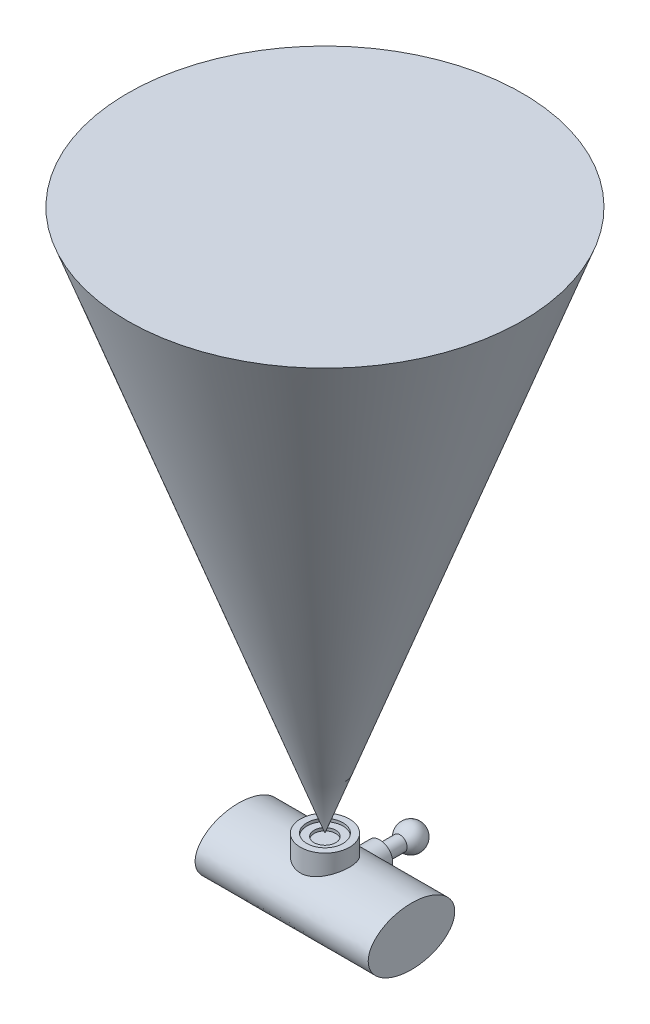
ISO-10303-21;
HEADER;
FILE_DESCRIPTION(('STEP AP214'),'2;1');
FILE_NAME('part.step','',(''),(''),'','','');
FILE_SCHEMA(('AUTOMOTIVE_DESIGN { 1 0 10303 214 1 1 1 1 }'));
ENDSEC;
DATA;
#1=APPLICATION_CONTEXT('core data for automotive mechanical design processes');
#2=APPLICATION_PROTOCOL_DEFINITION('international standard','automotive_design',2000,#1);
#3=PRODUCT_CONTEXT('',#1,'mechanical');
#4=PRODUCT('Part','Part','',(#3));
#5=PRODUCT_RELATED_PRODUCT_CATEGORY('part','',(#4));
#6=PRODUCT_DEFINITION_FORMATION('','',#4);
#7=PRODUCT_DEFINITION_CONTEXT('part definition',#1,'design');
#8=PRODUCT_DEFINITION('design','',#6,#7);
#9=PRODUCT_DEFINITION_SHAPE('','',#8);
#10=(LENGTH_UNIT() NAMED_UNIT(*) SI_UNIT(.MILLI.,.METRE.));
#11=(NAMED_UNIT(*) PLANE_ANGLE_UNIT() SI_UNIT($,.RADIAN.));
#12=(NAMED_UNIT(*) SI_UNIT($,.STERADIAN.) SOLID_ANGLE_UNIT());
#13=UNCERTAINTY_MEASURE_WITH_UNIT(LENGTH_MEASURE(1.E-05),#10,'distance_accuracy_value','');
#14=(GEOMETRIC_REPRESENTATION_CONTEXT(3) GLOBAL_UNCERTAINTY_ASSIGNED_CONTEXT((#13)) GLOBAL_UNIT_ASSIGNED_CONTEXT((#10,
#11,#12)) REPRESENTATION_CONTEXT('',''));
#15=CARTESIAN_POINT('',(0.,0.,0.));
#16=DIRECTION('',(0.,0.,1.));
#17=DIRECTION('',(1.,0.,0.));
#18=AXIS2_PLACEMENT_3D('',#15,#16,#17);
#19=CARTESIAN_POINT('',(0.,203.938524157182,-42.4040286651332));
#20=DIRECTION('',(0.,-1.,0.));
#21=DIRECTION('',(0.,0.,-1.));
#22=AXIS2_PLACEMENT_3D('',#19,#20,#21);
#23=PLANE('',#22);
#24=CARTESIAN_POINT('',(0.,203.938524157182,26.));
#25=DIRECTION('',(0.,1.,0.));
#26=DIRECTION('',(0.,0.,1.));
#27=AXIS2_PLACEMENT_3D('',#24,#25,#26);
#28=CIRCLE('',#27,68.4040286651332);
#29=CARTESIAN_POINT('',(0.,203.938524157182,94.4040286651332));
#30=VERTEX_POINT('',#29);
#31=EDGE_CURVE('E12',#30,#30,#28,.T.);
#32=ORIENTED_EDGE('',*,*,#31,.T.);
#33=EDGE_LOOP('',(#32));
#34=FACE_BOUND('',#33,.T.);
#35=ADVANCED_FACE('F49',(#34),#23,.F.);
#36=CARTESIAN_POINT('',(0.,16.,26.));
#37=DIRECTION('',(0.,1.,0.));
#38=DIRECTION('',(0.,0.,1.));
#39=AXIS2_PLACEMENT_3D('',#36,#37,#38);
#40=CONICAL_SURFACE('',#39,0.,0.349065850398863);
#41=ORIENTED_EDGE('',*,*,#31,.F.);
#42=EDGE_LOOP('',(#41));
#43=FACE_BOUND('',#42,.T.);
#44=CARTESIAN_POINT('',(0.,16.,26.));
#45=VERTEX_POINT('',#44);
#46=VERTEX_LOOP('',#45);
#47=FACE_BOUND('',#46,.T.);
#48=ADVANCED_FACE('F56',(#43,#47),#40,.T.);
#49=CLOSED_SHELL('',(#35,#48));
#50=MANIFOLD_SOLID_BREP('B2',#49);
#51=CARTESIAN_POINT('',(-30.,0.,26.));
#52=DIRECTION('',(1.,0.,0.));
#53=DIRECTION('',(0.,0.,-1.));
#54=AXIS2_PLACEMENT_3D('',#51,#52,#53);
#55=ELLIPSE('',#54,15.,10.);
#56=DIRECTION('',(1.,0.,0.));
#57=VECTOR('',#56,1.);
#58=SURFACE_OF_LINEAR_EXTRUSION('',#55,#57);
#59=CARTESIAN_POINT('',(-4.5,0.,11.));
#60=CARTESIAN_POINT('',(-4.50000179661353,0.113427751797759,10.999998104076));
#61=CARTESIAN_POINT('',(-4.49570683559703,0.226836941344397,11.002901009246));
#62=CARTESIAN_POINT('',(-4.47859826356174,0.452757044180179,11.0144232925091));
#63=CARTESIAN_POINT('',(-4.46578222935199,0.565267692732317,11.0230442966921));
#64=CARTESIAN_POINT('',(-4.43180974817744,0.788562805828208,11.0457667567975));
#65=CARTESIAN_POINT('',(-4.41064538078484,0.899345526949475,11.0598734170206));
#66=CARTESIAN_POINT('',(-4.36027244405676,1.11832652619657,11.0931795221124));
#67=CARTESIAN_POINT('',(-4.33106041679894,1.2265236715837,11.1123811560608));
#68=CARTESIAN_POINT('',(-4.26517045877855,1.4389622519027,11.1552431101488));
#69=CARTESIAN_POINT('',(-4.22853884802476,1.54322368635741,11.1788757031795));
#70=CARTESIAN_POINT('',(-4.14810455225398,1.74795320879676,11.2301062680023));
#71=CARTESIAN_POINT('',(-4.10429905696046,1.84841979113998,11.2577057932682));
#72=CARTESIAN_POINT('',(-3.96276861330985,2.14335152297756,11.3455197985101));
#73=CARTESIAN_POINT('',(-3.85486940196405,2.33154018599745,11.4107901373745));
#74=CARTESIAN_POINT('',(-3.60392158054914,2.70501209204091,11.5560344890988));
#75=CARTESIAN_POINT('',(-3.45853379199128,2.88838865227078,11.6368120136786));
#76=CARTESIAN_POINT('',(-3.14178140430147,3.23009476219036,11.8015115384798));
#77=CARTESIAN_POINT('',(-2.9703833618687,3.38839152146735,11.8854374807371));
#78=CARTESIAN_POINT('',(-2.68273694898729,3.61533784930147,12.0139878374257));
#79=CARTESIAN_POINT('',(-2.57435341999766,3.69332312112326,12.0600339860247));
#80=CARTESIAN_POINT('',(-2.35022785291713,3.83983685883343,12.1493942924411));
#81=CARTESIAN_POINT('',(-2.23448450976205,3.90836364064517,12.1927079629995));
#82=CARTESIAN_POINT('',(-1.99631105152499,4.03521042570358,12.2750533001104));
#83=CARTESIAN_POINT('',(-1.87389086705864,4.09354507251045,12.3140910794386));
#84=CARTESIAN_POINT('',(-1.62284749952471,4.1993929358368,12.3864372558138));
#85=CARTESIAN_POINT('',(-1.4942268565902,4.24691053886781,12.4197479739441));
#86=CARTESIAN_POINT('',(-1.26509018908745,4.31973368078795,12.4716061814889));
#87=CARTESIAN_POINT('',(-1.16574768179169,4.34761470798694,12.4917536413799));
#88=CARTESIAN_POINT('',(-0.964612007304901,4.39661582407501,12.5274851960585));
#89=CARTESIAN_POINT('',(-0.862819399121535,4.41773743974061,12.5430703212919));
#90=CARTESIAN_POINT('',(-0.657476723721926,4.45292768238192,12.5691922199446));
#91=CARTESIAN_POINT('',(-0.553928380872625,4.46700285717636,12.5797336797233));
#92=CARTESIAN_POINT('',(-0.345691829615696,4.48792223892815,12.5954464292999));
#93=CARTESIAN_POINT('',(-0.241003597346981,4.49476629422273,12.6006176064634));
#94=CARTESIAN_POINT('',(-0.0310453054331663,4.50112106870681,12.6054180778743));
#95=CARTESIAN_POINT('',(0.0742255277903985,4.50061560625957,12.6050351434851));
#96=CARTESIAN_POINT('',(0.284304014194313,4.49224025645326,12.5987109629353));
#97=CARTESIAN_POINT('',(0.389111666587928,4.48437035659018,12.5927697073373));
#98=CARTESIAN_POINT('',(0.59753363976473,4.46138456087639,12.5755269335715));
#99=CARTESIAN_POINT('',(0.70114731240602,4.44626490329595,12.5642226326772));
#100=CARTESIAN_POINT('',(0.906420191381641,4.40900057668016,12.5366209701257));
#101=CARTESIAN_POINT('',(1.00807936731996,4.38685579848486,12.5203235308826));
#102=CARTESIAN_POINT('',(1.20684557721036,4.33633809787617,12.4835980616951));
#103=CARTESIAN_POINT('',(1.3040029534458,4.30809806452624,12.4632588050804));
#104=CARTESIAN_POINT('',(1.49543340489877,4.24544833923509,12.4187969731321));
#105=CARTESIAN_POINT('',(1.58970548077597,4.21103653735249,12.3946731043083));
#106=CARTESIAN_POINT('',(1.86759038030875,4.09902022836665,12.3175003233271));
#107=CARTESIAN_POINT('',(2.04638550636764,4.01260547275993,12.2596281114524));
#108=CARTESIAN_POINT('',(2.41679295890204,3.80283298823422,12.1257342598217));
#109=CARTESIAN_POINT('',(2.60576432697492,3.67575343801002,12.0482915618635));
#110=CARTESIAN_POINT('',(2.96165670497873,3.39558471419742,11.8894313029242));
#111=CARTESIAN_POINT('',(3.12855059043843,3.24246406449339,11.8080090176696));
#112=CARTESIAN_POINT('',(3.46408364274005,2.88440804907728,11.6343295005055));
#113=CARTESIAN_POINT('',(3.62837513293085,2.67509021151676,11.5425289658539));
#114=CARTESIAN_POINT('',(3.84650148734915,2.33928769412491,11.4151611589783));
#115=CARTESIAN_POINT('',(3.91449348979772,2.22371190570305,11.3744262675036));
#116=CARTESIAN_POINT('',(4.04042479072698,1.98571503458002,11.2975729325259));
#117=CARTESIAN_POINT('',(4.09836705045653,1.86329598241597,11.2614531299735));
#118=CARTESIAN_POINT('',(4.1925136057426,1.63843067480823,11.2019279765487));
#119=CARTESIAN_POINT('',(4.2307339239465,1.53710867483584,11.1774393910207));
#120=CARTESIAN_POINT('',(4.29998446964481,1.33113882007355,11.1326700450054));
#121=CARTESIAN_POINT('',(4.33101618728443,1.22649165968925,11.1123884125382));
#122=CARTESIAN_POINT('',(4.3855094700779,1.01453053362565,11.0765382428872));
#123=CARTESIAN_POINT('',(4.40897647643548,0.907218544834051,11.0609663185684));
#124=CARTESIAN_POINT('',(4.44806119478178,0.690556060860621,11.0349200564462));
#125=CARTESIAN_POINT('',(4.46367877421417,0.581205531285499,11.0244458047293));
#126=CARTESIAN_POINT('',(4.48687763286799,0.360887958636143,11.0088554284552));
#127=CARTESIAN_POINT('',(4.49443095207693,0.249916634964487,11.0037579467049));
#128=CARTESIAN_POINT('',(4.50128932226477,0.0276022757401435,10.9991303202973));
#129=CARTESIAN_POINT('',(4.50059437511811,-0.0837407597280662,10.9996001743749));
#130=CARTESIAN_POINT('',(4.49096626715139,-0.305922193008737,11.0060942616813));
#131=CARTESIAN_POINT('',(4.48203186670135,-0.416760512364704,11.0121193306951));
#132=CARTESIAN_POINT('',(4.45606001427732,-0.637048543935594,11.029553870837));
#133=CARTESIAN_POINT('',(4.43902270985223,-0.746498281398482,11.0409632439203));
#134=CARTESIAN_POINT('',(4.39816713569207,-0.957646057710932,11.0681380131166));
#135=CARTESIAN_POINT('',(4.37474242379664,-1.05945337025825,11.0836493637226));
#136=CARTESIAN_POINT('',(4.32109931219396,-1.2605329468572,11.1188718356031));
#137=CARTESIAN_POINT('',(4.29087858863244,-1.35980433080277,11.1385843933337));
#138=CARTESIAN_POINT('',(4.1905005340399,-1.65296873635818,11.2033829235758));
#139=CARTESIAN_POINT('',(4.11059693349983,-1.84236612863191,11.2541505781957));
#140=CARTESIAN_POINT('',(3.91877250619583,-2.22329796423974,11.3722371155674));
#141=CARTESIAN_POINT('',(3.80451271966262,-2.413288590017,11.4406777339753));
#142=CARTESIAN_POINT('',(3.5511301526749,-2.7727038914783,11.5854144415518));
#143=CARTESIAN_POINT('',(3.41198359303289,-2.94210863515252,11.6617180139171));
#144=CARTESIAN_POINT('',(3.08631648900501,-3.28472085582264,11.829309093388));
#145=CARTESIAN_POINT('',(2.89576699053932,-3.45392474195579,11.9209878613513));
#146=CARTESIAN_POINT('',(2.48696209994966,-3.75899613254762,12.0979294572261));
#147=CARTESIAN_POINT('',(2.26871396155728,-3.89487233765052,12.1831939556316));
#148=CARTESIAN_POINT('',(1.84397141975699,-4.11059794030257,12.3249182480302));
#149=CARTESIAN_POINT('',(1.64110822990307,-4.19591661167427,12.3838018973718));
#150=CARTESIAN_POINT('',(1.32629457494211,-4.30153704143316,12.4585404951784));
#151=CARTESIAN_POINT('',(1.21960759709212,-4.33301685356221,12.4811883078199));
#152=CARTESIAN_POINT('',(1.00328986689162,-4.38814860065665,12.5212587563962));
#153=CARTESIAN_POINT('',(0.893660466169043,-4.41180406545493,12.5386837481917));
#154=CARTESIAN_POINT('',(0.671387824061793,-4.45107495470949,12.5678022585084));
#155=CARTESIAN_POINT('',(0.558728579140754,-4.4666313400165,12.5794536609622));
#156=CARTESIAN_POINT('',(0.332073640419358,-4.48917523480886,12.5963885825209));
#157=CARTESIAN_POINT('',(0.218077954497075,-4.49616279478024,12.6016721391439));
#158=CARTESIAN_POINT('',(-0.0102109097294636,-4.5014364012271,12.6056568556563));
#159=CARTESIAN_POINT('',(-0.124504034273567,-4.49972392396281,12.604359132286));
#160=CARTESIAN_POINT('',(-0.3523605073897,-4.48763387513054,12.5952369613043));
#161=CARTESIAN_POINT('',(-0.465923899310071,-4.47725682315053,12.5874129050571));
#162=CARTESIAN_POINT('',(-0.67923468310089,-4.44959929737168,12.5667252536962));
#163=CARTESIAN_POINT('',(-0.779156752898353,-4.43317928607142,12.5544926666724));
#164=CARTESIAN_POINT('',(-0.977042697073361,-4.39381133925923,12.5254491587045));
#165=CARTESIAN_POINT('',(-1.07500591430874,-4.37086125113962,12.5086367281154));
#166=CARTESIAN_POINT('',(-1.36511414597717,-4.29261252060113,12.4520128996179));
#167=CARTESIAN_POINT('',(-1.55359686105713,-4.22789955962537,12.4060025334264));
#168=CARTESIAN_POINT('',(-1.93310950394273,-4.06927952389765,12.2974236488978));
#169=CARTESIAN_POINT('',(-2.122961598469,-3.97333863531185,12.233770590982));
#170=CARTESIAN_POINT('',(-2.48517306088189,-3.75745013592127,12.0980430526655));
#171=CARTESIAN_POINT('',(-2.65752147832485,-3.63748763474619,12.0259633604053));
#172=CARTESIAN_POINT('',(-3.01530948599678,-3.34969077399854,11.8643378935222));
#173=CARTESIAN_POINT('',(-3.19666612782305,-3.17708160832445,11.7741433128102));
#174=CARTESIAN_POINT('',(-3.4460710098894,-2.89659995275487,11.6422994952934));
#175=CARTESIAN_POINT('',(-3.52549816686507,-2.79941005551074,11.5988871174457));
#176=CARTESIAN_POINT('',(-3.67639443055727,-2.59806555930813,11.5142416740982));
#177=CARTESIAN_POINT('',(-3.74786221934094,-2.49390981148232,11.4730089701066));
#178=CARTESIAN_POINT('',(-3.88653423833227,-2.27222651620535,11.3912915177966));
#179=CARTESIAN_POINT('',(-3.95318017729316,-2.15426984842072,11.3510202467923));
#180=CARTESIAN_POINT('',(-4.076059538743,-1.91160147196229,11.2754448375747));
#181=CARTESIAN_POINT('',(-4.13229869870981,-1.78689353472326,11.2401379649774));
#182=CARTESIAN_POINT('',(-4.23348505678554,-1.53179028546055,11.1757571788904));
#183=CARTESIAN_POINT('',(-4.27846027883129,-1.40141005473585,11.1466678236252));
#184=CARTESIAN_POINT('',(-4.35649158363439,-1.13583379404724,11.0957216245096));
#185=CARTESIAN_POINT('',(-4.38955548718639,-1.0006409882668,11.0738600357939));
#186=CARTESIAN_POINT('',(-4.44399003871495,-0.722290681803393,11.037665045924));
#187=CARTESIAN_POINT('',(-4.4649479028609,-0.579017000181097,11.0235979987963));
#188=CARTESIAN_POINT('',(-4.49295171576239,-0.290485399314258,11.0047667013232));
#189=CARTESIAN_POINT('',(-4.4999976997017,-0.145227485088864,11.0000024274507));
#190=CARTESIAN_POINT('',(-4.5,0.,11.));
#191=B_SPLINE_CURVE_WITH_KNOTS('',3,(#59,#60,#61,#62,#63,#64,#65,#66,#67,#68,#69,#70,#71,#72,
#73,#74,#75,#76,#77,#78,#79,#80,#81,#82,#83,#84,#85,#86,#87,#88,#89,#90,#91,#92,#93,#94,#95,#96,
#97,#98,#99,#100,#101,#102,#103,#104,#105,#106,#107,#108,#109,#110,#111,#112,#113,#114,#115,
#116,#117,#118,#119,#120,#121,#122,#123,#124,#125,#126,#127,#128,#129,#130,#131,#132,#133,#134,
#135,#136,#137,#138,#139,#140,#141,#142,#143,#144,#145,#146,#147,#148,#149,#150,#151,#152,#153,
#154,#155,#156,#157,#158,#159,#160,#161,#162,#163,#164,#165,#166,#167,#168,#169,#170,#171,#172,
#173,#174,#175,#176,#177,#178,#179,#180,#181,#182,#183,#184,#185,#186,#187,#188,#189,#190),
.UNSPECIFIED.,.T.,.F.,(4,2,2,2,2,2,2,2,2,2,2,2,2,2,2,2,2,2,2,2,2,2,2,2,2,2,2,2,2,2,2,2,2,2,2,2,
2,2,2,2,2,2,2,2,2,2,2,2,2,2,2,2,2,2,2,2,2,2,2,2,2,2,2,2,2,4),(0.,0.340133977224594,
0.680364721873554,1.02091903766603,1.36161991184411,1.70025597043293,2.03902500404053,
2.71595528338829,3.45599766251007,4.19699975952383,4.62027501382067,5.04362553499175,
5.46636271360192,5.88892815786315,6.20400329255007,6.51900720958741,6.83371786724526,
7.14843512539484,7.46384540997294,7.77925623008434,8.09483088688747,8.41041044749295,
8.71970201041908,9.0290995130492,9.6475397386973,10.3665098752997,11.086355295658,
11.9262098886761,12.3461636741822,12.7659935054501,13.098739900695,13.4314172581587,
13.7638547881668,14.0962979319883,14.4298900002783,14.7634819927587,15.0971241825146,
15.4307602970841,15.7472473454301,16.0638427795728,16.6965634639746,17.3900897781859,
18.0842823283624,18.8932694758549,19.7020452009277,20.3824710118762,20.7226592902244,
21.0626938879199,21.4051736737468,21.7476514417328,22.0900710985393,22.4324702229634,
22.7381204964925,23.0438716430928,23.6550155642333,24.3187766546416,24.9829504740448,
25.7776417863957,26.1757352892663,26.5738946117947,26.9973185201674,27.4205082858827,
27.8426344835977,28.2644830121933,28.699975440192,29.1354667668091),.UNSPECIFIED.);
#192=CARTESIAN_POINT('',(-4.5,0.,11.));
#193=VERTEX_POINT('',#192);
#194=EDGE_CURVE('E96',#193,#193,#191,.T.);
#195=ORIENTED_EDGE('',*,*,#194,.F.);
#196=EDGE_LOOP('',(#195));
#197=FACE_BOUND('',#196,.T.);
#198=CARTESIAN_POINT('',(30.,0.,26.));
#199=DIRECTION('',(1.,0.,0.));
#200=DIRECTION('',(0.,0.,-1.));
#201=AXIS2_PLACEMENT_3D('',#198,#199,#200);
#202=ELLIPSE('',#201,15.,10.);
#203=CARTESIAN_POINT('',(30.,0.,11.));
#204=VERTEX_POINT('',#203);
#205=EDGE_CURVE('E118',#204,#204,#202,.T.);
#206=ORIENTED_EDGE('',*,*,#205,.F.);
#207=EDGE_LOOP('',(#206));
#208=FACE_BOUND('',#207,.T.);
#209=CARTESIAN_POINT('',(-30.,0.,11.));
#210=VERTEX_POINT('',#209);
#211=EDGE_CURVE('E103',#210,#210,#55,.T.);
#212=ORIENTED_EDGE('',*,*,#211,.T.);
#213=EDGE_LOOP('',(#212));
#214=FACE_BOUND('',#213,.T.);
#215=CARTESIAN_POINT('',(0.,8.23947139620604,17.5000000000004));
#216=CARTESIAN_POINT('',(0.223826071442597,8.23947301211789,17.5000013876241));
#217=CARTESIAN_POINT('',(0.447734459925835,8.243540331611,17.5088535242802));
#218=CARTESIAN_POINT('',(0.893966089108362,8.25966017030362,17.5441750739895));
#219=CARTESIAN_POINT('',(1.11628819945479,8.27171790114709,17.570655985238));
#220=CARTESIAN_POINT('',(1.55814361221104,8.30339845870829,17.6410321665077));
#221=CARTESIAN_POINT('',(1.77766930888649,8.32303865168037,17.6849674192867));
#222=CARTESIAN_POINT('',(2.21190385110959,8.36916437209944,17.7898001768126));
#223=CARTESIAN_POINT('',(2.42661227943886,8.39565048999632,17.8506991446876));
#224=CARTESIAN_POINT('',(2.84895971129045,8.45442909036648,17.9885972503922));
#225=CARTESIAN_POINT('',(3.05662442376914,8.48669694197005,18.0655283079259));
#226=CARTESIAN_POINT('',(3.46463745079335,8.55608395314175,18.2350085304334));
#227=CARTESIAN_POINT('',(3.66498551908996,8.59320327579878,18.3275582204796));
#228=CARTESIAN_POINT('',(4.05724138712297,8.67118252456188,18.5275676759396));
#229=CARTESIAN_POINT('',(4.2491519704762,8.71204120309578,18.6350224746437));
#230=CARTESIAN_POINT('',(4.62366523547322,8.79639340137041,18.8641804841427));
#231=CARTESIAN_POINT('',(4.80626736108067,8.83988707817269,18.9858845446823));
#232=CARTESIAN_POINT('',(5.17412279304689,8.93160126350604,19.2521365718769));
#233=CARTESIAN_POINT('',(5.35861355764531,8.97993618711974,19.397699905987));
#234=CARTESIAN_POINT('',(5.71478351915561,9.07701227934481,19.7034676978128));
#235=CARTESIAN_POINT('',(5.88646760794631,9.12575328485038,19.8636665125237));
#236=CARTESIAN_POINT('',(6.21623688702605,9.22242804891593,20.1979691132443));
#237=CARTESIAN_POINT('',(6.37431205736054,9.27036119213112,20.372082965765));
#238=CARTESIAN_POINT('',(6.67568457052204,9.36416365931079,20.7330747674103));
#239=CARTESIAN_POINT('',(6.81898712184921,9.41003370743954,20.9199481788979));
#240=CARTESIAN_POINT('',(7.09490866869479,9.50023953574686,21.3125762504129));
#241=CARTESIAN_POINT('',(7.22693839073453,9.54445626096369,21.5187731625842));
#242=CARTESIAN_POINT('',(7.47306881870933,9.62832782896457,21.9425039796207));
#243=CARTESIAN_POINT('',(7.58716893244338,9.66798252105662,22.1600382586345));
#244=CARTESIAN_POINT('',(7.79638876307782,9.741681135902,22.6048976341687));
#245=CARTESIAN_POINT('',(7.89151378151209,9.77572662537068,22.8322199743183));
#246=CARTESIAN_POINT('',(8.06188719407887,9.83731895022829,23.2950466490371));
#247=CARTESIAN_POINT('',(8.1371367617531,9.86486616929592,23.5305504996014));
#248=CARTESIAN_POINT('',(8.2639219986207,9.9116038185268,23.9967092150158));
#249=CARTESIAN_POINT('',(8.31640414259958,9.9311255240141,24.2270736745726));
#250=CARTESIAN_POINT('',(8.40205772382955,9.96311671593995,24.6918497569));
#251=CARTESIAN_POINT('',(8.43522970626848,9.97558640147938,24.926261265217));
#252=CARTESIAN_POINT('',(8.48190254292267,9.99315988461634,25.3972434418982));
#253=CARTESIAN_POINT('',(8.49540890147593,9.99826574331895,25.6338134874336));
#254=CARTESIAN_POINT('',(8.50261966991353,10.0009895240807,26.1072952486588));
#255=CARTESIAN_POINT('',(8.49632469124433,9.99860767735297,26.3442069535727));
#256=CARTESIAN_POINT('',(8.46481412424188,9.98672281931004,26.8046661087129));
#257=CARTESIAN_POINT('',(8.44056029386674,9.97758181708727,27.0282894976787));
#258=CARTESIAN_POINT('',(8.37448636563997,9.95280586004161,27.472551528623));
#259=CARTESIAN_POINT('',(8.33266696954687,9.93717116464729,27.6931902894764));
#260=CARTESIAN_POINT('',(8.23185626218885,9.89975769593683,28.1299720279388));
#261=CARTESIAN_POINT('',(8.17286490569716,9.87797890643866,28.3461149937052));
#262=CARTESIAN_POINT('',(8.03823885545271,9.82875863464863,28.7724897815615));
#263=CARTESIAN_POINT('',(7.9626037786335,9.80131702202399,28.9827214674737));
#264=CARTESIAN_POINT('',(7.79445571707964,9.74105771619501,29.3981155831786));
#265=CARTESIAN_POINT('',(7.70177522423072,9.70818703005336,29.603202456198));
#266=CARTESIAN_POINT('',(7.50077383890588,9.63798684395928,30.0048526166814));
#267=CARTESIAN_POINT('',(7.392447323431,9.60065574182192,30.2014128065885));
#268=CARTESIAN_POINT('',(7.16096363447629,9.52235855462546,30.5848394940473));
#269=CARTESIAN_POINT('',(7.03780592483332,9.48139233816727,30.7717056407997));
#270=CARTESIAN_POINT('',(6.77747736058284,9.3967202353108,31.1347542588992));
#271=CARTESIAN_POINT('',(6.64030577359974,9.35301420577402,31.3109361711128));
#272=CARTESIAN_POINT('',(6.34445875758179,9.26124622454769,31.6615774962853));
#273=CARTESIAN_POINT('',(6.18499835495175,9.2130785550557,31.8353474997309));
#274=CARTESIAN_POINT('',(5.85231737203551,9.11597512618356,32.1689446530438));
#275=CARTESIAN_POINT('',(5.67909633736472,9.06703934148264,32.3287713421282));
#276=CARTESIAN_POINT('',(5.31983360978287,8.96966964611511,32.6336180990124));
#277=CARTESIAN_POINT('',(5.13378729848449,8.92123592354001,32.7786327858607));
#278=CARTESIAN_POINT('',(4.74994416385345,8.82622896736984,33.0529199968707));
#279=CARTESIAN_POINT('',(4.55214588951522,8.77965596470861,33.1821905710843));
#280=CARTESIAN_POINT('',(4.13896198559302,8.68822330699745,33.4282409376099));
#281=CARTESIAN_POINT('',(3.9232062432388,8.64347669552495,33.5444424607965));
#282=CARTESIAN_POINT('',(3.48174803788924,8.5590211578781,33.758062305051));
#283=CARTESIAN_POINT('',(3.25604988918073,8.51931007510306,33.8554886764385));
#284=CARTESIAN_POINT('',(2.7962057708535,8.4464043520622,34.030675159956));
#285=CARTESIAN_POINT('',(2.56206283116984,8.41320740156823,34.1084422470556));
#286=CARTESIAN_POINT('',(2.08698839038467,8.35466766771735,34.2435094022696));
#287=CARTESIAN_POINT('',(1.84605746544989,8.32932421993016,34.3008112018724));
#288=CARTESIAN_POINT('',(1.37347997385535,8.28880812441326,34.3915458697071));
#289=CARTESIAN_POINT('',(1.14210517787154,8.27313091405973,34.4261701621131));
#290=CARTESIAN_POINT('',(0.676868157371376,8.25036971048445,34.47623605731));
#291=CARTESIAN_POINT('',(0.443006033268306,8.24328537168733,34.4916784315313));
#292=CARTESIAN_POINT('',(-0.0252185323366505,8.23801104969889,34.50318707568));
#293=CARTESIAN_POINT('',(-0.259580788042708,8.23981819717183,34.4992595963737));
#294=CARTESIAN_POINT('',(-0.726941536740396,8.25224354733433,34.4720919615596));
#295=CARTESIAN_POINT('',(-0.959940072948505,8.26286146926991,34.4488524214276));
#296=CARTESIAN_POINT('',(-1.40708123406717,8.29146060241791,34.3855604477936));
#297=CARTESIAN_POINT('',(-1.62143592745431,8.30889703869859,34.3467473522918));
#298=CARTESIAN_POINT('',(-2.04590803437974,8.35042683362237,34.2529691593179));
#299=CARTESIAN_POINT('',(-2.25602567155111,8.37451983993779,34.1980049167051));
#300=CARTESIAN_POINT('',(-2.67075901894316,8.42856463067372,34.0724220172817));
#301=CARTESIAN_POINT('',(-2.87537440305833,8.45851676148397,34.0018024348991));
#302=CARTESIAN_POINT('',(-3.27802350558709,8.52335992858267,33.8454589748255));
#303=CARTESIAN_POINT('',(-3.47605464862745,8.55825287000843,33.7597292676551));
#304=CARTESIAN_POINT('',(-3.87313407337149,8.63361219403506,33.5696385582736));
#305=CARTESIAN_POINT('',(-4.07183127940065,8.6742581161897,33.464615469693));
#306=CARTESIAN_POINT('',(-4.459867488446,8.7586594551097,33.239469545827));
#307=CARTESIAN_POINT('',(-4.64920326401953,8.80241593176804,33.1193415528607));
#308=CARTESIAN_POINT('',(-5.01752610073787,8.89184750283129,32.8647330818589));
#309=CARTESIAN_POINT('',(-5.19651160446362,8.93752288420033,32.7302504524816));
#310=CARTESIAN_POINT('',(-5.54321427152478,9.02962877149653,32.4476965844847));
#311=CARTESIAN_POINT('',(-5.71093087624955,9.07605931471631,32.2996246730902));
#312=CARTESIAN_POINT('',(-6.04690406443398,9.17218627174215,31.9785520492799));
#313=CARTESIAN_POINT('',(-6.2141729984083,9.22185348135685,31.8045071114903));
#314=CARTESIAN_POINT('',(-6.53347363689901,9.31942173237228,31.4426038627296));
#315=CARTESIAN_POINT('',(-6.68551015940361,9.36732332918411,31.254749952316));
#316=CARTESIAN_POINT('',(-6.97341668183576,9.46015401939145,30.8662044272427));
#317=CARTESIAN_POINT('',(-7.10927956638965,9.50508180066629,30.66550722161));
#318=CARTESIAN_POINT('',(-7.3636610951662,9.5907701211356,30.252675811999));
#319=CARTESIAN_POINT('',(-7.48218720325027,9.63153245135643,30.0405465839033));
#320=CARTESIAN_POINT('',(-7.70058207377071,9.70773655498967,29.6069051357526));
#321=CARTESIAN_POINT('',(-7.80051361819887,9.74319614968836,29.3854277054559));
#322=CARTESIAN_POINT('',(-7.98129555841558,9.8080527548611,28.9339471934475));
#323=CARTESIAN_POINT('',(-8.06214582370228,9.8374497238711,28.7039440534387));
#324=CARTESIAN_POINT('',(-8.20392260790352,9.88940712124127,28.2372114579513));
#325=CARTESIAN_POINT('',(-8.26485651308617,9.91197008386269,28.0004845315682));
#326=CARTESIAN_POINT('',(-8.36618135836584,9.94967828324883,27.5220968116317));
#327=CARTESIAN_POINT('',(-8.40657351459594,9.96482395913716,27.2804363110419));
#328=CARTESIAN_POINT('',(-8.46457256810448,9.98662340900635,26.8087366857814));
#329=CARTESIAN_POINT('',(-8.48339847117776,9.99373116880519,26.5788676489993));
#330=CARTESIAN_POINT('',(-8.50230199998196,10.0008683297942,26.1182546534257));
#331=CARTESIAN_POINT('',(-8.50238041831321,10.0008980302284,25.8875107320348));
#332=CARTESIAN_POINT('',(-8.48379044009783,9.99387907036976,25.4269241220793));
#333=CARTESIAN_POINT('',(-8.46512479226632,9.9868314479277,25.1970813063337));
#334=CARTESIAN_POINT('',(-8.40924333641117,9.96582696300058,24.7399838285081));
#335=CARTESIAN_POINT('',(-8.37202761192846,9.9518701316314,24.5127291547769));
#336=CARTESIAN_POINT('',(-8.28071233298427,9.91785833855255,24.0687487873872));
#337=CARTESIAN_POINT('',(-8.22711222463142,9.89798416778483,23.8519061666721));
#338=CARTESIAN_POINT('',(-8.1032235000665,9.85245734493289,23.4236748088728));
#339=CARTESIAN_POINT('',(-8.03293531372059,9.82680484169291,23.2122859314619));
#340=CARTESIAN_POINT('',(-7.87627478606011,9.7702807239247,22.7963007126436));
#341=CARTESIAN_POINT('',(-7.78990370082315,9.73940951699559,22.5917038422484));
#342=CARTESIAN_POINT('',(-7.60172660557648,9.67309828929428,22.1904213649359));
#343=CARTESIAN_POINT('',(-7.49991472004447,9.63765653011051,21.9937388057694));
#344=CARTESIAN_POINT('',(-7.27769853048999,9.56162402999211,21.602559137086));
#345=CARTESIAN_POINT('',(-7.15675886587803,9.5208943240608,21.4083926858839));
#346=CARTESIAN_POINT('',(-6.89998603102083,9.43627467602131,21.0308582356246));
#347=CARTESIAN_POINT('',(-6.76414730504851,9.39238355715915,20.8474943041757));
#348=CARTESIAN_POINT('',(-6.33564130847865,9.25747047813386,20.3152005668573));
#349=CARTESIAN_POINT('',(-6.02183005895945,9.16315422209205,19.9837987021451));
#350=CARTESIAN_POINT('',(-5.3253452629494,8.96917540014114,19.3575160543847));
#351=CARTESIAN_POINT('',(-4.93971789167204,8.86952272881492,19.06590430464));
#352=CARTESIAN_POINT('',(-4.32712974283205,8.72893543327007,18.6798589051292));
#353=CARTESIAN_POINT('',(-4.1170402885543,8.68351850443579,18.559655106611));
#354=CARTESIAN_POINT('',(-3.68668082745529,8.59714587607496,18.3373009348608));
#355=CARTESIAN_POINT('',(-3.46641547193322,8.55618816646728,18.2351424143289));
#356=CARTESIAN_POINT('',(-3.01718043077527,8.48020445914974,18.049801614867));
#357=CARTESIAN_POINT('',(-2.7882148900074,8.44517567915979,17.9666104287037));
#358=CARTESIAN_POINT('',(-2.32316664584224,8.38239721224071,17.8200068634951));
#359=CARTESIAN_POINT('',(-2.08708749562452,8.35464395631402,17.7565847838464));
#360=CARTESIAN_POINT('',(-1.61019667725078,8.30762092697919,17.6503416575444));
#361=CARTESIAN_POINT('',(-1.36939970743882,8.28832817408678,17.607464778525));
#362=CARTESIAN_POINT('',(-0.884575579297553,8.25898318182936,17.5426214083519));
#363=CARTESIAN_POINT('',(-0.640551156463665,8.24892356944568,17.5206382322718));
#364=CARTESIAN_POINT('',(-0.330086789740515,8.24229173526876,17.5061545111236));
#365=CARTESIAN_POINT('',(-0.264097295331672,8.24123479855962,17.503847161176));
#366=CARTESIAN_POINT('',(-0.132074256140013,8.23982438933111,17.5007696980471));
#367=CARTESIAN_POINT('',(-0.0660407111944533,8.23947091942526,17.4999995905769));
#368=CARTESIAN_POINT('',(0.,8.23947139620604,17.5000000000004));
#369=B_SPLINE_CURVE_WITH_KNOTS('',3,(#215,#216,#217,#218,#219,#220,#221,#222,#223,#224,#225,
#226,#227,#228,#229,#230,#231,#232,#233,#234,#235,#236,#237,#238,#239,#240,#241,#242,#243,#244,
#245,#246,#247,#248,#249,#250,#251,#252,#253,#254,#255,#256,#257,#258,#259,#260,#261,#262,#263,
#264,#265,#266,#267,#268,#269,#270,#271,#272,#273,#274,#275,#276,#277,#278,#279,#280,#281,#282,
#283,#284,#285,#286,#287,#288,#289,#290,#291,#292,#293,#294,#295,#296,#297,#298,#299,#300,#301,
#302,#303,#304,#305,#306,#307,#308,#309,#310,#311,#312,#313,#314,#315,#316,#317,#318,#319,#320,
#321,#322,#323,#324,#325,#326,#327,#328,#329,#330,#331,#332,#333,#334,#335,#336,#337,#338,#339,
#340,#341,#342,#343,#344,#345,#346,#347,#348,#349,#350,#351,#352,#353,#354,#355,#356,#357,#358,
#359,#360,#361,#362,#363,#364,#365,#366,#367,#368),.UNSPECIFIED.,.T.,.F.,(4,2,2,2,2,2,2,2,2,2,2,
2,2,2,2,2,2,2,2,2,2,2,2,2,2,2,2,2,2,2,2,2,2,2,2,2,2,2,2,2,2,2,2,2,2,2,2,2,2,2,2,2,2,2,2,2,2,2,2,
2,2,2,2,2,2,2,2,2,2,2,2,2,2,2,2,2,4),(0.,0.671410570720991,1.34325949201552,2.01665637835719,
2.69011136347735,3.36076276058,4.03143670835756,4.70188770732412,5.37237870854872,
6.09133796208973,6.81002116699239,7.52922907644384,8.24818253544423,8.99366294489334,
9.73916797180717,10.4844644162074,11.2297168448974,11.9400253173362,12.6503137345145,
13.3604033062552,14.0704709513207,14.7450355763115,15.4195732544634,16.0941127091997,
16.7686676905405,17.4502450326633,18.1320679381039,18.8139154995576,19.4957987131156,
20.2171334532797,20.9384920222719,21.6601117235555,22.3818207085592,23.1282082281841,
23.8742749997963,24.6200766997263,25.3658152853203,26.0683101515514,26.7707767649487,
27.4730167030436,28.1752342652285,28.8301020384119,29.4849351565321,30.139806999901,
30.7949320477745,31.4793748390759,32.1640519763187,32.8488318711837,33.5336456862702,
34.2721250681238,35.0103701277461,35.7489387773695,36.4871885151833,37.2228985368026,
37.9586135899891,38.6940554822724,39.4294538291221,40.1208388446942,40.8121946301004,
41.5034490467524,42.1947003503433,42.8666869562712,43.5386562544555,44.2105730936988,
44.8827462547514,45.578997383017,46.2755090254983,47.6675959024789,49.1410904623548,
49.8791526236152,50.6168806991571,51.3542616139952,52.091280127965,52.8262842444023,
53.560700919777,53.7588023588796,53.9569045339663),.UNSPECIFIED.);
#370=CARTESIAN_POINT('',(0.,8.23947139620604,17.5000000000004));
#371=VERTEX_POINT('',#370);
#372=EDGE_CURVE('E82',#371,#371,#369,.T.);
#373=ORIENTED_EDGE('',*,*,#372,.T.);
#374=EDGE_LOOP('',(#373));
#375=FACE_BOUND('',#374,.T.);
#376=ADVANCED_FACE('F78',(#197,#208,#214,#375),#58,.T.);
#377=CARTESIAN_POINT('',(0.,0.,7.));
#378=DIRECTION('',(0.,0.,-1.));
#379=DIRECTION('',(-1.,0.,0.));
#380=AXIS2_PLACEMENT_3D('',#377,#378,#379);
#381=CYLINDRICAL_SURFACE('',#380,2.5);
#382=CARTESIAN_POINT('',(0.,0.,7.));
#383=DIRECTION('',(0.,0.,1.));
#384=DIRECTION('',(1.,0.,0.));
#385=AXIS2_PLACEMENT_3D('',#382,#383,#384);
#386=CIRCLE('',#385,2.5);
#387=CARTESIAN_POINT('',(2.5,0.,7.));
#388=VERTEX_POINT('',#387);
#389=EDGE_CURVE('E48',#388,#388,#386,.T.);
#390=ORIENTED_EDGE('',*,*,#389,.F.);
#391=EDGE_LOOP('',(#390));
#392=FACE_BOUND('',#391,.T.);
#393=CARTESIAN_POINT('',(0.,0.,0.));
#394=DIRECTION('',(0.,0.,1.));
#395=DIRECTION('',(1.,0.,0.));
#396=AXIS2_PLACEMENT_3D('',#393,#394,#395);
#397=CIRCLE('',#396,2.5);
#398=CARTESIAN_POINT('',(2.5,0.,0.));
#399=VERTEX_POINT('',#398);
#400=EDGE_CURVE('E134',#399,#399,#397,.F.);
#401=ORIENTED_EDGE('',*,*,#400,.F.);
#402=EDGE_LOOP('',(#401));
#403=FACE_BOUND('',#402,.T.);
#404=ADVANCED_FACE('F80',(#392,#403),#381,.T.);
#405=CARTESIAN_POINT('',(0.,0.,17.));
#406=DIRECTION('',(0.,0.,-1.));
#407=DIRECTION('',(-1.,0.,0.));
#408=AXIS2_PLACEMENT_3D('',#405,#406,#407);
#409=CYLINDRICAL_SURFACE('',#408,4.5);
#410=ORIENTED_EDGE('',*,*,#194,.T.);
#411=EDGE_LOOP('',(#410));
#412=FACE_BOUND('',#411,.T.);
#413=CARTESIAN_POINT('',(0.,0.,7.));
#414=DIRECTION('',(0.,0.,1.));
#415=DIRECTION('',(1.,0.,0.));
#416=AXIS2_PLACEMENT_3D('',#413,#414,#415);
#417=CIRCLE('',#416,4.5);
#418=CARTESIAN_POINT('',(4.5,0.,7.));
#419=VERTEX_POINT('',#418);
#420=EDGE_CURVE('E91',#419,#419,#417,.T.);
#421=ORIENTED_EDGE('',*,*,#420,.T.);
#422=EDGE_LOOP('',(#421));
#423=FACE_BOUND('',#422,.T.);
#424=ADVANCED_FACE('F104',(#412,#423),#409,.T.);
#425=CARTESIAN_POINT('',(0.,0.,7.));
#426=DIRECTION('',(0.,0.,1.));
#427=DIRECTION('',(1.,0.,0.));
#428=AXIS2_PLACEMENT_3D('',#425,#426,#427);
#429=PLANE('',#428);
#430=ORIENTED_EDGE('',*,*,#389,.T.);
#431=EDGE_LOOP('',(#430));
#432=FACE_BOUND('',#431,.T.);
#433=ORIENTED_EDGE('',*,*,#420,.F.);
#434=EDGE_LOOP('',(#433));
#435=FACE_BOUND('',#434,.T.);
#436=ADVANCED_FACE('F113',(#432,#435),#429,.F.);
#437=CARTESIAN_POINT('',(-30.,0.,26.));
#438=DIRECTION('',(1.,0.,0.));
#439=DIRECTION('',(0.,0.,-1.));
#440=AXIS2_PLACEMENT_3D('',#437,#438,#439);
#441=PLANE('',#440);
#442=ORIENTED_EDGE('',*,*,#211,.F.);
#443=EDGE_LOOP('',(#442));
#444=FACE_BOUND('',#443,.T.);
#445=ADVANCED_FACE('F111',(#444),#441,.F.);
#446=CARTESIAN_POINT('',(30.,0.,26.));
#447=DIRECTION('',(1.,0.,0.));
#448=DIRECTION('',(0.,0.,-1.));
#449=AXIS2_PLACEMENT_3D('',#446,#447,#448);
#450=PLANE('',#449);
#451=ORIENTED_EDGE('',*,*,#205,.T.);
#452=EDGE_LOOP('',(#451));
#453=FACE_BOUND('',#452,.T.);
#454=ADVANCED_FACE('F167',(#453),#450,.T.);
#455=CARTESIAN_POINT('',(0.,16.,26.));
#456=DIRECTION('',(0.,-1.,0.));
#457=DIRECTION('',(0.,0.,-1.));
#458=AXIS2_PLACEMENT_3D('',#455,#456,#457);
#459=CYLINDRICAL_SURFACE('',#458,8.5);
#460=ORIENTED_EDGE('',*,*,#372,.F.);
#461=EDGE_LOOP('',(#460));
#462=FACE_BOUND('',#461,.T.);
#463=CARTESIAN_POINT('',(0.,16.,26.));
#464=DIRECTION('',(0.,1.,0.));
#465=DIRECTION('',(0.,0.,1.));
#466=AXIS2_PLACEMENT_3D('',#463,#464,#465);
#467=CIRCLE('',#466,8.5);
#468=CARTESIAN_POINT('',(0.,16.,34.5));
#469=VERTEX_POINT('',#468);
#470=EDGE_CURVE('E121',#469,#469,#467,.T.);
#471=ORIENTED_EDGE('',*,*,#470,.F.);
#472=EDGE_LOOP('',(#471));
#473=FACE_BOUND('',#472,.T.);
#474=ADVANCED_FACE('F163',(#462,#473),#459,.T.);
#475=CARTESIAN_POINT('',(0.,16.,26.));
#476=DIRECTION('',(0.,1.,0.));
#477=DIRECTION('',(0.,0.,1.));
#478=AXIS2_PLACEMENT_3D('',#475,#476,#477);
#479=PLANE('',#478);
#480=CARTESIAN_POINT('',(0.,16.,26.));
#481=DIRECTION('',(0.,1.,0.));
#482=DIRECTION('',(0.,0.,1.));
#483=AXIS2_PLACEMENT_3D('',#480,#481,#482);
#484=CIRCLE('',#483,6.25);
#485=CARTESIAN_POINT('',(0.,16.,32.25));
#486=VERTEX_POINT('',#485);
#487=EDGE_CURVE('E125',#486,#486,#484,.T.);
#488=ORIENTED_EDGE('',*,*,#487,.F.);
#489=EDGE_LOOP('',(#488));
#490=FACE_BOUND('',#489,.T.);
#491=ORIENTED_EDGE('',*,*,#470,.T.);
#492=EDGE_LOOP('',(#491));
#493=FACE_BOUND('',#492,.T.);
#494=ADVANCED_FACE('F166',(#490,#493),#479,.T.);
#495=CARTESIAN_POINT('',(0.,15.,26.));
#496=DIRECTION('',(0.,1.,0.));
#497=DIRECTION('',(0.,0.,1.));
#498=AXIS2_PLACEMENT_3D('',#495,#496,#497);
#499=CYLINDRICAL_SURFACE('',#498,6.25);
#500=CARTESIAN_POINT('',(0.,15.,26.));
#501=DIRECTION('',(0.,1.,0.));
#502=DIRECTION('',(0.,0.,1.));
#503=AXIS2_PLACEMENT_3D('',#500,#501,#502);
#504=CIRCLE('',#503,6.25);
#505=CARTESIAN_POINT('',(0.,15.,32.25));
#506=VERTEX_POINT('',#505);
#507=EDGE_CURVE('E124',#506,#506,#504,.T.);
#508=ORIENTED_EDGE('',*,*,#507,.F.);
#509=EDGE_LOOP('',(#508));
#510=FACE_BOUND('',#509,.T.);
#511=ORIENTED_EDGE('',*,*,#487,.T.);
#512=EDGE_LOOP('',(#511));
#513=FACE_BOUND('',#512,.T.);
#514=ADVANCED_FACE('F171',(#510,#513),#499,.F.);
#515=CARTESIAN_POINT('',(0.,15.,26.));
#516=DIRECTION('',(0.,1.,0.));
#517=DIRECTION('',(0.,0.,1.));
#518=AXIS2_PLACEMENT_3D('',#515,#516,#517);
#519=PLANE('',#518);
#520=CARTESIAN_POINT('',(0.,15.,26.));
#521=DIRECTION('',(0.,1.,0.));
#522=DIRECTION('',(0.,0.,1.));
#523=AXIS2_PLACEMENT_3D('',#520,#521,#522);
#524=CIRCLE('',#523,3.75);
#525=CARTESIAN_POINT('',(0.,15.,29.75));
#526=VERTEX_POINT('',#525);
#527=EDGE_CURVE('E131',#526,#526,#524,.T.);
#528=ORIENTED_EDGE('',*,*,#527,.F.);
#529=EDGE_LOOP('',(#528));
#530=FACE_BOUND('',#529,.T.);
#531=ORIENTED_EDGE('',*,*,#507,.T.);
#532=EDGE_LOOP('',(#531));
#533=FACE_BOUND('',#532,.T.);
#534=ADVANCED_FACE('F177',(#530,#533),#519,.T.);
#535=CARTESIAN_POINT('',(0.,14.,26.));
#536=DIRECTION('',(0.,1.,0.));
#537=DIRECTION('',(0.,0.,1.));
#538=AXIS2_PLACEMENT_3D('',#535,#536,#537);
#539=CYLINDRICAL_SURFACE('',#538,3.75);
#540=CARTESIAN_POINT('',(0.,14.,26.));
#541=DIRECTION('',(0.,1.,0.));
#542=DIRECTION('',(0.,0.,1.));
#543=AXIS2_PLACEMENT_3D('',#540,#541,#542);
#544=CIRCLE('',#543,3.75);
#545=CARTESIAN_POINT('',(0.,14.,29.75));
#546=VERTEX_POINT('',#545);
#547=EDGE_CURVE('E128',#546,#546,#544,.T.);
#548=ORIENTED_EDGE('',*,*,#547,.F.);
#549=EDGE_LOOP('',(#548));
#550=FACE_BOUND('',#549,.T.);
#551=ORIENTED_EDGE('',*,*,#527,.T.);
#552=EDGE_LOOP('',(#551));
#553=FACE_BOUND('',#552,.T.);
#554=ADVANCED_FACE('F238',(#550,#553),#539,.F.);
#555=CARTESIAN_POINT('',(0.,14.,26.));
#556=DIRECTION('',(0.,1.,0.));
#557=DIRECTION('',(0.,0.,1.));
#558=AXIS2_PLACEMENT_3D('',#555,#556,#557);
#559=PLANE('',#558);
#560=ORIENTED_EDGE('',*,*,#547,.T.);
#561=EDGE_LOOP('',(#560));
#562=FACE_BOUND('',#561,.T.);
#563=ADVANCED_FACE('F247',(#562),#559,.T.);
#564=CARTESIAN_POINT('',(0.,0.,-3.74165738677394));
#565=DIRECTION('',(0.,0.,-1.));
#566=DIRECTION('',(1.,0.,0.));
#567=AXIS2_PLACEMENT_3D('',#564,#565,#566);
#568=SPHERICAL_SURFACE('',#567,4.5);
#569=ORIENTED_EDGE('',*,*,#400,.T.);
#570=EDGE_LOOP('',(#569));
#571=FACE_BOUND('',#570,.T.);
#572=ADVANCED_FACE('F140',(#571),#568,.T.);
#573=CLOSED_SHELL('',(#376,#404,#424,#436,#445,#454,#474,#494,#514,#534,#554,#563,#572));
#574=MANIFOLD_SOLID_BREP('B6',#573);
#575=ADVANCED_BREP_SHAPE_REPRESENTATION('',(#18,#50,#574),#14);
#576=SHAPE_DEFINITION_REPRESENTATION(#9,#575);
ENDSEC;
END-ISO-10303-21;
